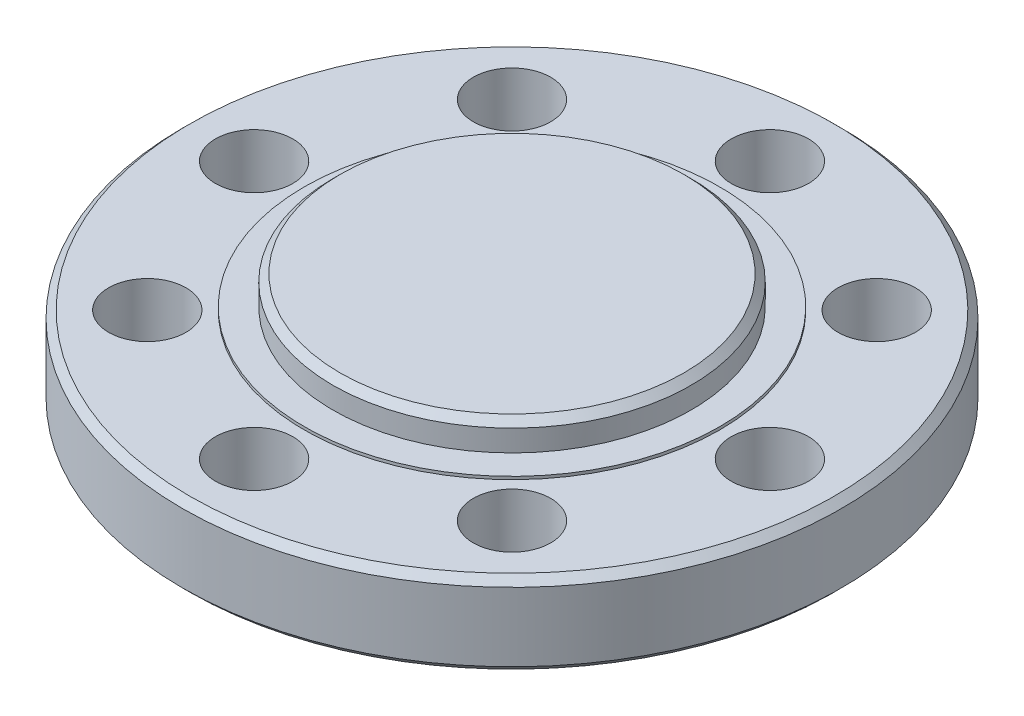
ISO-10303-21;
HEADER;
FILE_DESCRIPTION(('STEP AP214'),'2;1');
FILE_NAME('part.step','',(''),(''),'','','');
FILE_SCHEMA(('AUTOMOTIVE_DESIGN { 1 0 10303 214 1 1 1 1 }'));
ENDSEC;
DATA;
#1=APPLICATION_CONTEXT('core data for automotive mechanical design processes');
#2=APPLICATION_PROTOCOL_DEFINITION('international standard','automotive_design',2000,#1);
#3=PRODUCT_CONTEXT('',#1,'mechanical');
#4=PRODUCT('Part','Part','',(#3));
#5=PRODUCT_RELATED_PRODUCT_CATEGORY('part','',(#4));
#6=PRODUCT_DEFINITION_FORMATION('','',#4);
#7=PRODUCT_DEFINITION_CONTEXT('part definition',#1,'design');
#8=PRODUCT_DEFINITION('design','',#6,#7);
#9=PRODUCT_DEFINITION_SHAPE('','',#8);
#10=(LENGTH_UNIT() NAMED_UNIT(*) SI_UNIT(.MILLI.,.METRE.));
#11=(NAMED_UNIT(*) PLANE_ANGLE_UNIT() SI_UNIT($,.RADIAN.));
#12=(NAMED_UNIT(*) SI_UNIT($,.STERADIAN.) SOLID_ANGLE_UNIT());
#13=UNCERTAINTY_MEASURE_WITH_UNIT(LENGTH_MEASURE(1.E-05),#10,'distance_accuracy_value','');
#14=(GEOMETRIC_REPRESENTATION_CONTEXT(3) GLOBAL_UNCERTAINTY_ASSIGNED_CONTEXT((#13)) GLOBAL_UNIT_ASSIGNED_CONTEXT((#10,
#11,#12)) REPRESENTATION_CONTEXT('',''));
#15=CARTESIAN_POINT('',(0.,0.,0.));
#16=DIRECTION('',(0.,0.,1.));
#17=DIRECTION('',(1.,0.,0.));
#18=AXIS2_PLACEMENT_3D('',#15,#16,#17);
#19=CARTESIAN_POINT('',(0.,0.2499999999589,-1.030652223857E-13));
#20=DIRECTION('',(0.,1.,0.));
#21=DIRECTION('',(0.,0.,-1.));
#22=AXIS2_PLACEMENT_3D('',#19,#20,#21);
#23=CONICAL_SURFACE('',#22,22.74999999996,0.785398163397448);
#24=CARTESIAN_POINT('',(0.,0.5,0.));
#25=DIRECTION('',(0.,1.,0.));
#26=DIRECTION('',(-1.,0.,0.));
#27=AXIS2_PLACEMENT_3D('',#24,#25,#26);
#28=CIRCLE('',#27,23.);
#29=CARTESIAN_POINT('',(0.,0.499999999999503,23.0000000000005));
#30=VERTEX_POINT('',#29);
#31=CARTESIAN_POINT('',(-23.,0.5,0.));
#32=VERTEX_POINT('',#31);
#33=EDGE_CURVE('E28',#30,#32,#28,.T.);
#34=ORIENTED_EDGE('',*,*,#33,.F.);
#35=DIRECTION('',(0.,-0.707106781186548,-0.707106781186548));
#36=VECTOR('',#35,1.);
#37=CARTESIAN_POINT('',(0.,0.2499999999589,22.7499999999599));
#38=LINE('',#37,#36);
#39=CARTESIAN_POINT('',(0.,-5.51364509604468E-13,22.5000000000004));
#40=VERTEX_POINT('',#39);
#41=EDGE_CURVE('E11',#30,#40,#38,.T.);
#42=ORIENTED_EDGE('',*,*,#41,.T.);
#43=CARTESIAN_POINT('',(0.,0.,-1.030652223857E-13));
#44=DIRECTION('',(0.,1.,0.));
#45=DIRECTION('',(1.,0.,0.));
#46=AXIS2_PLACEMENT_3D('',#43,#44,#45);
#47=CIRCLE('',#46,22.5);
#48=EDGE_CURVE('E265',#40,#40,#47,.T.);
#49=ORIENTED_EDGE('',*,*,#48,.T.);
#50=ORIENTED_EDGE('',*,*,#41,.F.);
#51=CARTESIAN_POINT('',(0.,0.5,0.));
#52=DIRECTION('',(0.,1.,0.));
#53=DIRECTION('',(-1.,0.,0.));
#54=AXIS2_PLACEMENT_3D('',#51,#52,#53);
#55=CIRCLE('',#54,23.);
#56=EDGE_CURVE('E160',#32,#30,#55,.T.);
#57=ORIENTED_EDGE('',*,*,#56,.F.);
#58=EDGE_LOOP('',(#34,#42,#49,#50,#57));
#59=FACE_BOUND('',#58,.T.);
#60=ADVANCED_FACE('F17',(#59),#23,.T.);
#61=CARTESIAN_POINT('',(0.,-0.4,0.));
#62=DIRECTION('',(0.,1.,0.));
#63=DIRECTION('',(1.,0.,0.));
#64=AXIS2_PLACEMENT_3D('',#61,#62,#63);
#65=CYLINDRICAL_SURFACE('',#64,23.);
#66=CARTESIAN_POINT('',(0.,5.3,0.));
#67=DIRECTION('',(0.,1.,0.));
#68=DIRECTION('',(1.,0.,0.));
#69=AXIS2_PLACEMENT_3D('',#66,#67,#68);
#70=CIRCLE('',#69,23.);
#71=CARTESIAN_POINT('',(-23.,5.3,0.));
#72=VERTEX_POINT('',#71);
#73=CARTESIAN_POINT('',(0.,5.30000000000095,23.000000000001));
#74=VERTEX_POINT('',#73);
#75=EDGE_CURVE('E150',#72,#74,#70,.T.);
#76=ORIENTED_EDGE('',*,*,#75,.F.);
#77=DIRECTION('',(0.,-1.,0.));
#78=VECTOR('',#77,1.);
#79=CARTESIAN_POINT('',(-23.,-0.4,0.));
#80=LINE('',#79,#78);
#81=EDGE_CURVE('E156',#72,#32,#80,.T.);
#82=ORIENTED_EDGE('',*,*,#81,.T.);
#83=ORIENTED_EDGE('',*,*,#56,.T.);
#84=ORIENTED_EDGE('',*,*,#33,.T.);
#85=ORIENTED_EDGE('',*,*,#81,.F.);
#86=CARTESIAN_POINT('',(0.,5.3,0.));
#87=DIRECTION('',(0.,1.,0.));
#88=DIRECTION('',(1.,0.,0.));
#89=AXIS2_PLACEMENT_3D('',#86,#87,#88);
#90=CIRCLE('',#89,23.);
#91=EDGE_CURVE('E161',#74,#72,#90,.T.);
#92=ORIENTED_EDGE('',*,*,#91,.F.);
#93=EDGE_LOOP('',(#76,#82,#83,#84,#85,#92));
#94=FACE_BOUND('',#93,.T.);
#95=ADVANCED_FACE('F19',(#94),#65,.T.);
#96=CARTESIAN_POINT('',(0.,5.550000000072,-1.030652223857E-13));
#97=DIRECTION('',(0.,-1.,0.));
#98=DIRECTION('',(0.,0.,-1.));
#99=AXIS2_PLACEMENT_3D('',#96,#97,#98);
#100=CONICAL_SURFACE('',#99,22.74999999993,0.785398163397448);
#101=ORIENTED_EDGE('',*,*,#75,.T.);
#102=DIRECTION('',(0.,0.707106781186548,-0.707106781186548));
#103=VECTOR('',#102,1.);
#104=CARTESIAN_POINT('',(0.,5.550000000072,22.7499999999299));
#105=LINE('',#104,#103);
#106=CARTESIAN_POINT('',(0.,5.800000000001,22.5000000000009));
#107=VERTEX_POINT('',#106);
#108=EDGE_CURVE('E154',#74,#107,#105,.T.);
#109=ORIENTED_EDGE('',*,*,#108,.T.);
#110=CARTESIAN_POINT('',(0.,5.8,-1.030652223857E-13));
#111=DIRECTION('',(0.,1.,0.));
#112=DIRECTION('',(1.,0.,0.));
#113=AXIS2_PLACEMENT_3D('',#110,#111,#112);
#114=CIRCLE('',#113,22.5);
#115=EDGE_CURVE('E224',#107,#107,#114,.T.);
#116=ORIENTED_EDGE('',*,*,#115,.F.);
#117=ORIENTED_EDGE('',*,*,#108,.F.);
#118=ORIENTED_EDGE('',*,*,#91,.T.);
#119=EDGE_LOOP('',(#101,#109,#116,#117,#118));
#120=FACE_BOUND('',#119,.T.);
#121=ADVANCED_FACE('F326',(#120),#100,.T.);
#122=CARTESIAN_POINT('',(12.72792206136,5.8,12.72792206136));
#123=DIRECTION('',(0.,-1.,0.));
#124=DIRECTION('',(0.707106781186548,0.,0.707106781186548));
#125=AXIS2_PLACEMENT_3D('',#122,#123,#124);
#126=CYLINDRICAL_SURFACE('',#125,2.7);
#127=CARTESIAN_POINT('',(12.72792206136,5.8,12.72792206136));
#128=DIRECTION('',(0.,-1.,0.));
#129=DIRECTION('',(0.707106781186548,0.,0.707106781186548));
#130=AXIS2_PLACEMENT_3D('',#127,#128,#129);
#131=CIRCLE('',#130,2.7);
#132=CARTESIAN_POINT('',(10.8187337521563,5.8,10.8187337521563));
#133=VERTEX_POINT('',#132);
#134=EDGE_CURVE('E170',#133,#133,#131,.T.);
#135=ORIENTED_EDGE('',*,*,#134,.F.);
#136=DIRECTION('',(0.,-1.,0.));
#137=VECTOR('',#136,1.);
#138=CARTESIAN_POINT('',(10.8187337521563,5.8,10.8187337521563));
#139=LINE('',#138,#137);
#140=CARTESIAN_POINT('',(10.8187337521563,0.,10.8187337521563));
#141=VERTEX_POINT('',#140);
#142=EDGE_CURVE('E155',#133,#141,#139,.T.);
#143=ORIENTED_EDGE('',*,*,#142,.T.);
#144=CARTESIAN_POINT('',(12.72792206136,0.,12.72792206136));
#145=DIRECTION('',(0.,-1.,0.));
#146=DIRECTION('',(0.707106781186548,0.,0.707106781186548));
#147=AXIS2_PLACEMENT_3D('',#144,#145,#146);
#148=CIRCLE('',#147,2.7);
#149=EDGE_CURVE('E182',#141,#141,#148,.T.);
#150=ORIENTED_EDGE('',*,*,#149,.T.);
#151=ORIENTED_EDGE('',*,*,#142,.F.);
#152=EDGE_LOOP('',(#135,#143,#150,#151));
#153=FACE_BOUND('',#152,.T.);
#154=ADVANCED_FACE('F357',(#153),#126,.F.);
#155=CARTESIAN_POINT('',(0.,5.8,18.));
#156=DIRECTION('',(0.,-1.,0.));
#157=DIRECTION('',(0.,0.,1.));
#158=AXIS2_PLACEMENT_3D('',#155,#156,#157);
#159=CYLINDRICAL_SURFACE('',#158,2.7);
#160=CARTESIAN_POINT('',(0.,5.8,18.));
#161=DIRECTION('',(0.,-1.,0.));
#162=DIRECTION('',(0.,0.,1.));
#163=AXIS2_PLACEMENT_3D('',#160,#161,#162);
#164=CIRCLE('',#163,2.7);
#165=CARTESIAN_POINT('',(0.,5.8,15.3));
#166=VERTEX_POINT('',#165);
#167=EDGE_CURVE('E175',#166,#166,#164,.T.);
#168=ORIENTED_EDGE('',*,*,#167,.F.);
#169=DIRECTION('',(0.,-1.,0.));
#170=VECTOR('',#169,1.);
#171=CARTESIAN_POINT('',(0.,5.8,15.3));
#172=LINE('',#171,#170);
#173=CARTESIAN_POINT('',(0.,0.,15.3));
#174=VERTEX_POINT('',#173);
#175=EDGE_CURVE('E169',#166,#174,#172,.T.);
#176=ORIENTED_EDGE('',*,*,#175,.T.);
#177=CARTESIAN_POINT('',(0.,0.,18.));
#178=DIRECTION('',(0.,-1.,0.));
#179=DIRECTION('',(0.,0.,1.));
#180=AXIS2_PLACEMENT_3D('',#177,#178,#179);
#181=CIRCLE('',#180,2.7);
#182=EDGE_CURVE('E193',#174,#174,#181,.T.);
#183=ORIENTED_EDGE('',*,*,#182,.T.);
#184=ORIENTED_EDGE('',*,*,#175,.F.);
#185=EDGE_LOOP('',(#168,#176,#183,#184));
#186=FACE_BOUND('',#185,.T.);
#187=ADVANCED_FACE('F360',(#186),#159,.F.);
#188=CARTESIAN_POINT('',(-12.72792206136,5.8,12.72792206136));
#189=DIRECTION('',(0.,-1.,0.));
#190=DIRECTION('',(-0.707106781186548,0.,0.707106781186548));
#191=AXIS2_PLACEMENT_3D('',#188,#189,#190);
#192=CYLINDRICAL_SURFACE('',#191,2.7);
#193=CARTESIAN_POINT('',(-12.72792206136,5.8,12.72792206136));
#194=DIRECTION('',(0.,-1.,0.));
#195=DIRECTION('',(-0.707106781186548,0.,0.707106781186548));
#196=AXIS2_PLACEMENT_3D('',#193,#194,#195);
#197=CIRCLE('',#196,2.7);
#198=CARTESIAN_POINT('',(-10.8187337521563,5.8,10.8187337521563));
#199=VERTEX_POINT('',#198);
#200=EDGE_CURVE('E21',#199,#199,#197,.T.);
#201=ORIENTED_EDGE('',*,*,#200,.F.);
#202=DIRECTION('',(0.,-1.,0.));
#203=VECTOR('',#202,1.);
#204=CARTESIAN_POINT('',(-10.8187337521563,5.8,10.8187337521563));
#205=LINE('',#204,#203);
#206=CARTESIAN_POINT('',(-10.8187337521563,0.,10.8187337521563));
#207=VERTEX_POINT('',#206);
#208=EDGE_CURVE('E165',#199,#207,#205,.T.);
#209=ORIENTED_EDGE('',*,*,#208,.T.);
#210=CARTESIAN_POINT('',(-12.72792206136,0.,12.72792206136));
#211=DIRECTION('',(0.,-1.,0.));
#212=DIRECTION('',(-0.707106781186548,0.,0.707106781186548));
#213=AXIS2_PLACEMENT_3D('',#210,#211,#212);
#214=CIRCLE('',#213,2.7);
#215=EDGE_CURVE('E203',#207,#207,#214,.T.);
#216=ORIENTED_EDGE('',*,*,#215,.T.);
#217=ORIENTED_EDGE('',*,*,#208,.F.);
#218=EDGE_LOOP('',(#201,#209,#216,#217));
#219=FACE_BOUND('',#218,.T.);
#220=ADVANCED_FACE('F349',(#219),#192,.F.);
#221=CARTESIAN_POINT('',(-18.,5.8,0.));
#222=DIRECTION('',(0.,-1.,0.));
#223=DIRECTION('',(-1.,0.,0.));
#224=AXIS2_PLACEMENT_3D('',#221,#222,#223);
#225=CYLINDRICAL_SURFACE('',#224,2.7);
#226=CARTESIAN_POINT('',(-18.,5.8,0.));
#227=DIRECTION('',(0.,-1.,0.));
#228=DIRECTION('',(-1.,0.,0.));
#229=AXIS2_PLACEMENT_3D('',#226,#227,#228);
#230=CIRCLE('',#229,2.7);
#231=CARTESIAN_POINT('',(-15.3,5.8,0.));
#232=VERTEX_POINT('',#231);
#233=EDGE_CURVE('E215',#232,#232,#230,.T.);
#234=ORIENTED_EDGE('',*,*,#233,.F.);
#235=DIRECTION('',(0.,-1.,0.));
#236=VECTOR('',#235,1.);
#237=CARTESIAN_POINT('',(-15.3,5.8,0.));
#238=LINE('',#237,#236);
#239=CARTESIAN_POINT('',(-15.3,0.,0.));
#240=VERTEX_POINT('',#239);
#241=EDGE_CURVE('E143',#232,#240,#238,.T.);
#242=ORIENTED_EDGE('',*,*,#241,.T.);
#243=CARTESIAN_POINT('',(-18.,0.,0.));
#244=DIRECTION('',(0.,-1.,0.));
#245=DIRECTION('',(-1.,0.,0.));
#246=AXIS2_PLACEMENT_3D('',#243,#244,#245);
#247=CIRCLE('',#246,2.7);
#248=EDGE_CURVE('E210',#240,#240,#247,.T.);
#249=ORIENTED_EDGE('',*,*,#248,.T.);
#250=ORIENTED_EDGE('',*,*,#241,.F.);
#251=EDGE_LOOP('',(#234,#242,#249,#250));
#252=FACE_BOUND('',#251,.T.);
#253=ADVANCED_FACE('F346',(#252),#225,.F.);
#254=CARTESIAN_POINT('',(-12.72792206136,5.8,-12.72792206136));
#255=DIRECTION('',(0.,-1.,0.));
#256=DIRECTION('',(-0.707106781186548,0.,-0.707106781186548));
#257=AXIS2_PLACEMENT_3D('',#254,#255,#256);
#258=CYLINDRICAL_SURFACE('',#257,2.7);
#259=CARTESIAN_POINT('',(-12.72792206136,5.8,-12.72792206136));
#260=DIRECTION('',(0.,-1.,0.));
#261=DIRECTION('',(-0.707106781186548,0.,-0.707106781186548));
#262=AXIS2_PLACEMENT_3D('',#259,#260,#261);
#263=CIRCLE('',#262,2.7);
#264=CARTESIAN_POINT('',(-10.8187337521563,5.8,-10.8187337521563));
#265=VERTEX_POINT('',#264);
#266=EDGE_CURVE('E211',#265,#265,#263,.T.);
#267=ORIENTED_EDGE('',*,*,#266,.F.);
#268=DIRECTION('',(0.,-1.,0.));
#269=VECTOR('',#268,1.);
#270=CARTESIAN_POINT('',(-10.8187337521563,5.8,-10.8187337521563));
#271=LINE('',#270,#269);
#272=CARTESIAN_POINT('',(-10.8187337521563,0.,-10.8187337521563));
#273=VERTEX_POINT('',#272);
#274=EDGE_CURVE('E136',#265,#273,#271,.T.);
#275=ORIENTED_EDGE('',*,*,#274,.T.);
#276=CARTESIAN_POINT('',(-12.72792206136,0.,-12.72792206136));
#277=DIRECTION('',(0.,-1.,0.));
#278=DIRECTION('',(-0.707106781186548,0.,-0.707106781186548));
#279=AXIS2_PLACEMENT_3D('',#276,#277,#278);
#280=CIRCLE('',#279,2.7);
#281=EDGE_CURVE('E222',#273,#273,#280,.T.);
#282=ORIENTED_EDGE('',*,*,#281,.T.);
#283=ORIENTED_EDGE('',*,*,#274,.F.);
#284=EDGE_LOOP('',(#267,#275,#282,#283));
#285=FACE_BOUND('',#284,.T.);
#286=ADVANCED_FACE('F348',(#285),#258,.F.);
#287=CARTESIAN_POINT('',(0.,5.8,-18.));
#288=DIRECTION('',(0.,-1.,0.));
#289=DIRECTION('',(0.,0.,-1.));
#290=AXIS2_PLACEMENT_3D('',#287,#288,#289);
#291=CYLINDRICAL_SURFACE('',#290,2.7);
#292=CARTESIAN_POINT('',(0.,5.8,-18.));
#293=DIRECTION('',(0.,-1.,0.));
#294=DIRECTION('',(0.,0.,-1.));
#295=AXIS2_PLACEMENT_3D('',#292,#293,#294);
#296=CIRCLE('',#295,2.7);
#297=CARTESIAN_POINT('',(0.,5.8,-15.3));
#298=VERTEX_POINT('',#297);
#299=EDGE_CURVE('E134',#298,#298,#296,.T.);
#300=ORIENTED_EDGE('',*,*,#299,.F.);
#301=DIRECTION('',(0.,-1.,0.));
#302=VECTOR('',#301,1.);
#303=CARTESIAN_POINT('',(0.,5.8,-15.3));
#304=LINE('',#303,#302);
#305=CARTESIAN_POINT('',(0.,0.,-15.3));
#306=VERTEX_POINT('',#305);
#307=EDGE_CURVE('E129',#298,#306,#304,.T.);
#308=ORIENTED_EDGE('',*,*,#307,.T.);
#309=CARTESIAN_POINT('',(0.,0.,-18.));
#310=DIRECTION('',(0.,-1.,0.));
#311=DIRECTION('',(0.,0.,-1.));
#312=AXIS2_PLACEMENT_3D('',#309,#310,#311);
#313=CIRCLE('',#312,2.7);
#314=EDGE_CURVE('E132',#306,#306,#313,.T.);
#315=ORIENTED_EDGE('',*,*,#314,.T.);
#316=ORIENTED_EDGE('',*,*,#307,.F.);
#317=EDGE_LOOP('',(#300,#308,#315,#316));
#318=FACE_BOUND('',#317,.T.);
#319=ADVANCED_FACE('F130',(#318),#291,.F.);
#320=CARTESIAN_POINT('',(12.72792206136,5.8,-12.72792206136));
#321=DIRECTION('',(0.,-1.,0.));
#322=DIRECTION('',(0.707106781186548,0.,-0.707106781186548));
#323=AXIS2_PLACEMENT_3D('',#320,#321,#322);
#324=CYLINDRICAL_SURFACE('',#323,2.7);
#325=CARTESIAN_POINT('',(12.72792206136,5.8,-12.72792206136));
#326=DIRECTION('',(0.,-1.,0.));
#327=DIRECTION('',(0.707106781186548,0.,-0.707106781186548));
#328=AXIS2_PLACEMENT_3D('',#325,#326,#327);
#329=CIRCLE('',#328,2.7);
#330=CARTESIAN_POINT('',(10.8187337521563,5.8,-10.8187337521563));
#331=VERTEX_POINT('',#330);
#332=EDGE_CURVE('E227',#331,#331,#329,.T.);
#333=ORIENTED_EDGE('',*,*,#332,.F.);
#334=DIRECTION('',(0.,-1.,0.));
#335=VECTOR('',#334,1.);
#336=CARTESIAN_POINT('',(10.8187337521563,5.8,-10.8187337521563));
#337=LINE('',#336,#335);
#338=CARTESIAN_POINT('',(10.8187337521563,0.,-10.8187337521563));
#339=VERTEX_POINT('',#338);
#340=EDGE_CURVE('E121',#331,#339,#337,.T.);
#341=ORIENTED_EDGE('',*,*,#340,.T.);
#342=CARTESIAN_POINT('',(12.72792206136,0.,-12.72792206136));
#343=DIRECTION('',(0.,-1.,0.));
#344=DIRECTION('',(0.707106781186548,0.,-0.707106781186548));
#345=AXIS2_PLACEMENT_3D('',#342,#343,#344);
#346=CIRCLE('',#345,2.7);
#347=EDGE_CURVE('E223',#339,#339,#346,.T.);
#348=ORIENTED_EDGE('',*,*,#347,.T.);
#349=ORIENTED_EDGE('',*,*,#340,.F.);
#350=EDGE_LOOP('',(#333,#341,#348,#349));
#351=FACE_BOUND('',#350,.T.);
#352=ADVANCED_FACE('F354',(#351),#324,.F.);
#353=CARTESIAN_POINT('',(0.,8.,0.));
#354=DIRECTION('',(0.,1.,0.));
#355=DIRECTION('',(1.,0.,0.));
#356=AXIS2_PLACEMENT_3D('',#353,#354,#355);
#357=PLANE('',#356);
#358=CARTESIAN_POINT('',(0.,8.,0.));
#359=DIRECTION('',(0.,1.,0.));
#360=DIRECTION('',(1.,0.,0.));
#361=AXIS2_PLACEMENT_3D('',#358,#359,#360);
#362=CIRCLE('',#361,12.);
#363=CARTESIAN_POINT('',(0.,8.000000000001,12.000000000001));
#364=VERTEX_POINT('',#363);
#365=EDGE_CURVE('E145',#364,#364,#362,.T.);
#366=ORIENTED_EDGE('',*,*,#365,.T.);
#367=EDGE_LOOP('',(#366));
#368=FACE_BOUND('',#367,.T.);
#369=ADVANCED_FACE('F366',(#368),#357,.T.);
#370=CARTESIAN_POINT('',(0.,7.750000000252,0.));
#371=DIRECTION('',(0.,-1.,0.));
#372=DIRECTION('',(0.,0.,-1.));
#373=AXIS2_PLACEMENT_3D('',#370,#371,#372);
#374=CONICAL_SURFACE('',#373,12.24999999975,0.785398163397448);
#375=CARTESIAN_POINT('',(0.,7.5,0.));
#376=DIRECTION('',(0.,1.,0.));
#377=DIRECTION('',(1.,0.,0.));
#378=AXIS2_PLACEMENT_3D('',#375,#376,#377);
#379=CIRCLE('',#378,12.5);
#380=CARTESIAN_POINT('',(-12.5,7.5,0.));
#381=VERTEX_POINT('',#380);
#382=CARTESIAN_POINT('',(0.,7.50000000000099,12.500000000001));
#383=VERTEX_POINT('',#382);
#384=EDGE_CURVE('E264',#381,#383,#379,.T.);
#385=ORIENTED_EDGE('',*,*,#384,.T.);
#386=DIRECTION('',(0.,0.707106781186548,-0.707106781186548));
#387=VECTOR('',#386,1.);
#388=CARTESIAN_POINT('',(0.,7.750000000252,12.24999999975));
#389=LINE('',#388,#387);
#390=EDGE_CURVE('E216',#383,#364,#389,.T.);
#391=ORIENTED_EDGE('',*,*,#390,.T.);
#392=ORIENTED_EDGE('',*,*,#365,.F.);
#393=ORIENTED_EDGE('',*,*,#390,.F.);
#394=CARTESIAN_POINT('',(0.,7.5,0.));
#395=DIRECTION('',(0.,1.,0.));
#396=DIRECTION('',(1.,0.,0.));
#397=AXIS2_PLACEMENT_3D('',#394,#395,#396);
#398=CIRCLE('',#397,12.5);
#399=EDGE_CURVE('E220',#383,#381,#398,.T.);
#400=ORIENTED_EDGE('',*,*,#399,.T.);
#401=EDGE_LOOP('',(#385,#391,#392,#393,#400));
#402=FACE_BOUND('',#401,.T.);
#403=ADVANCED_FACE('F315',(#402),#374,.T.);
#404=CARTESIAN_POINT('',(0.,-0.4,0.));
#405=DIRECTION('',(0.,1.,0.));
#406=DIRECTION('',(1.,0.,0.));
#407=AXIS2_PLACEMENT_3D('',#404,#405,#406);
#408=CYLINDRICAL_SURFACE('',#407,12.5);
#409=ORIENTED_EDGE('',*,*,#384,.F.);
#410=DIRECTION('',(0.,-1.,0.));
#411=VECTOR('',#410,1.);
#412=CARTESIAN_POINT('',(-12.5,-0.4,0.));
#413=LINE('',#412,#411);
#414=CARTESIAN_POINT('',(-12.5,6.,0.));
#415=VERTEX_POINT('',#414);
#416=EDGE_CURVE('E260',#381,#415,#413,.T.);
#417=ORIENTED_EDGE('',*,*,#416,.T.);
#418=CARTESIAN_POINT('',(0.,6.,0.));
#419=DIRECTION('',(0.,1.,0.));
#420=DIRECTION('',(1.,0.,0.));
#421=AXIS2_PLACEMENT_3D('',#418,#419,#420);
#422=CIRCLE('',#421,12.5);
#423=EDGE_CURVE('E256',#415,#415,#422,.T.);
#424=ORIENTED_EDGE('',*,*,#423,.T.);
#425=ORIENTED_EDGE('',*,*,#416,.F.);
#426=ORIENTED_EDGE('',*,*,#399,.F.);
#427=EDGE_LOOP('',(#409,#417,#424,#425,#426));
#428=FACE_BOUND('',#427,.T.);
#429=ADVANCED_FACE('F305',(#428),#408,.T.);
#430=CARTESIAN_POINT('',(0.,6.,0.));
#431=DIRECTION('',(0.,1.,0.));
#432=DIRECTION('',(1.,0.,0.));
#433=AXIS2_PLACEMENT_3D('',#430,#431,#432);
#434=PLANE('',#433);
#435=ORIENTED_EDGE('',*,*,#423,.F.);
#436=EDGE_LOOP('',(#435));
#437=FACE_BOUND('',#436,.T.);
#438=CARTESIAN_POINT('',(0.,6.,0.));
#439=DIRECTION('',(0.,-1.,0.));
#440=DIRECTION('',(1.,0.,0.));
#441=AXIS2_PLACEMENT_3D('',#438,#439,#440);
#442=CIRCLE('',#441,14.5);
#443=CARTESIAN_POINT('',(-14.5,6.,0.));
#444=VERTEX_POINT('',#443);
#445=EDGE_CURVE('E252',#444,#444,#442,.T.);
#446=ORIENTED_EDGE('',*,*,#445,.F.);
#447=EDGE_LOOP('',(#446));
#448=FACE_BOUND('',#447,.T.);
#449=ADVANCED_FACE('F303',(#437,#448),#434,.T.);
#450=CARTESIAN_POINT('',(0.,-0.4,0.));
#451=DIRECTION('',(0.,1.,0.));
#452=DIRECTION('',(1.,0.,0.));
#453=AXIS2_PLACEMENT_3D('',#450,#451,#452);
#454=CYLINDRICAL_SURFACE('',#453,14.5);
#455=ORIENTED_EDGE('',*,*,#445,.T.);
#456=DIRECTION('',(0.,-1.,0.));
#457=VECTOR('',#456,1.);
#458=CARTESIAN_POINT('',(-14.5,-0.4,0.));
#459=LINE('',#458,#457);
#460=CARTESIAN_POINT('',(-14.5,5.8,0.));
#461=VERTEX_POINT('',#460);
#462=EDGE_CURVE('E253',#444,#461,#459,.T.);
#463=ORIENTED_EDGE('',*,*,#462,.T.);
#464=CARTESIAN_POINT('',(0.,5.8,0.));
#465=DIRECTION('',(0.,1.,0.));
#466=DIRECTION('',(1.,0.,0.));
#467=AXIS2_PLACEMENT_3D('',#464,#465,#466);
#468=CIRCLE('',#467,14.5);
#469=EDGE_CURVE('E174',#461,#461,#468,.T.);
#470=ORIENTED_EDGE('',*,*,#469,.T.);
#471=ORIENTED_EDGE('',*,*,#462,.F.);
#472=EDGE_LOOP('',(#455,#463,#470,#471));
#473=FACE_BOUND('',#472,.T.);
#474=ADVANCED_FACE('F299',(#473),#454,.T.);
#475=CARTESIAN_POINT('',(0.,5.8,0.));
#476=DIRECTION('',(0.,1.,0.));
#477=DIRECTION('',(1.,0.,0.));
#478=AXIS2_PLACEMENT_3D('',#475,#476,#477);
#479=PLANE('',#478);
#480=ORIENTED_EDGE('',*,*,#469,.F.);
#481=EDGE_LOOP('',(#480));
#482=FACE_BOUND('',#481,.T.);
#483=ORIENTED_EDGE('',*,*,#134,.T.);
#484=EDGE_LOOP('',(#483));
#485=FACE_BOUND('',#484,.T.);
#486=ORIENTED_EDGE('',*,*,#167,.T.);
#487=EDGE_LOOP('',(#486));
#488=FACE_BOUND('',#487,.T.);
#489=ORIENTED_EDGE('',*,*,#200,.T.);
#490=EDGE_LOOP('',(#489));
#491=FACE_BOUND('',#490,.T.);
#492=ORIENTED_EDGE('',*,*,#233,.T.);
#493=EDGE_LOOP('',(#492));
#494=FACE_BOUND('',#493,.T.);
#495=ORIENTED_EDGE('',*,*,#266,.T.);
#496=EDGE_LOOP('',(#495));
#497=FACE_BOUND('',#496,.T.);
#498=ORIENTED_EDGE('',*,*,#299,.T.);
#499=EDGE_LOOP('',(#498));
#500=FACE_BOUND('',#499,.T.);
#501=ORIENTED_EDGE('',*,*,#332,.T.);
#502=EDGE_LOOP('',(#501));
#503=FACE_BOUND('',#502,.T.);
#504=CARTESIAN_POINT('',(18.,5.8,0.));
#505=DIRECTION('',(0.,-1.,0.));
#506=DIRECTION('',(1.,0.,0.));
#507=AXIS2_PLACEMENT_3D('',#504,#505,#506);
#508=CIRCLE('',#507,2.7);
#509=CARTESIAN_POINT('',(15.3,5.8,0.));
#510=VERTEX_POINT('',#509);
#511=EDGE_CURVE('E181',#510,#510,#508,.T.);
#512=ORIENTED_EDGE('',*,*,#511,.T.);
#513=EDGE_LOOP('',(#512));
#514=FACE_BOUND('',#513,.T.);
#515=ORIENTED_EDGE('',*,*,#115,.T.);
#516=EDGE_LOOP('',(#515));
#517=FACE_BOUND('',#516,.T.);
#518=ADVANCED_FACE('F313',(#482,#485,#488,#491,#494,#497,#500,#503,#514,#517),#479,.T.);
#519=CARTESIAN_POINT('',(18.,5.8,0.));
#520=DIRECTION('',(0.,-1.,0.));
#521=DIRECTION('',(1.,0.,0.));
#522=AXIS2_PLACEMENT_3D('',#519,#520,#521);
#523=CYLINDRICAL_SURFACE('',#522,2.7);
#524=ORIENTED_EDGE('',*,*,#511,.F.);
#525=DIRECTION('',(0.,-1.,0.));
#526=VECTOR('',#525,1.);
#527=CARTESIAN_POINT('',(15.3,5.8,0.));
#528=LINE('',#527,#526);
#529=CARTESIAN_POINT('',(15.3,0.,0.));
#530=VERTEX_POINT('',#529);
#531=EDGE_CURVE('E190',#510,#530,#528,.T.);
#532=ORIENTED_EDGE('',*,*,#531,.T.);
#533=CARTESIAN_POINT('',(18.,0.,0.));
#534=DIRECTION('',(0.,-1.,0.));
#535=DIRECTION('',(1.,0.,0.));
#536=AXIS2_PLACEMENT_3D('',#533,#534,#535);
#537=CIRCLE('',#536,2.7);
#538=EDGE_CURVE('E178',#530,#530,#537,.T.);
#539=ORIENTED_EDGE('',*,*,#538,.T.);
#540=ORIENTED_EDGE('',*,*,#531,.F.);
#541=EDGE_LOOP('',(#524,#532,#539,#540));
#542=FACE_BOUND('',#541,.T.);
#543=ADVANCED_FACE('F330',(#542),#523,.F.);
#544=CARTESIAN_POINT('',(0.,0.,0.));
#545=DIRECTION('',(0.,1.,0.));
#546=DIRECTION('',(1.,0.,0.));
#547=AXIS2_PLACEMENT_3D('',#544,#545,#546);
#548=PLANE('',#547);
#549=ORIENTED_EDGE('',*,*,#538,.F.);
#550=EDGE_LOOP('',(#549));
#551=FACE_BOUND('',#550,.T.);
#552=ORIENTED_EDGE('',*,*,#149,.F.);
#553=EDGE_LOOP('',(#552));
#554=FACE_BOUND('',#553,.T.);
#555=ORIENTED_EDGE('',*,*,#182,.F.);
#556=EDGE_LOOP('',(#555));
#557=FACE_BOUND('',#556,.T.);
#558=ORIENTED_EDGE('',*,*,#215,.F.);
#559=EDGE_LOOP('',(#558));
#560=FACE_BOUND('',#559,.T.);
#561=ORIENTED_EDGE('',*,*,#248,.F.);
#562=EDGE_LOOP('',(#561));
#563=FACE_BOUND('',#562,.T.);
#564=ORIENTED_EDGE('',*,*,#281,.F.);
#565=EDGE_LOOP('',(#564));
#566=FACE_BOUND('',#565,.T.);
#567=ORIENTED_EDGE('',*,*,#314,.F.);
#568=EDGE_LOOP('',(#567));
#569=FACE_BOUND('',#568,.T.);
#570=ORIENTED_EDGE('',*,*,#347,.F.);
#571=EDGE_LOOP('',(#570));
#572=FACE_BOUND('',#571,.T.);
#573=ORIENTED_EDGE('',*,*,#48,.F.);
#574=EDGE_LOOP('',(#573));
#575=FACE_BOUND('',#574,.T.);
#576=ADVANCED_FACE('F332',(#551,#554,#557,#560,#563,#566,#569,#572,#575),#548,.F.);
#577=CLOSED_SHELL('',(#60,#95,#121,#154,#187,#220,#253,#286,#319,#352,#369,#403,#429,#449,#474,
#518,#543,#576));
#578=MANIFOLD_SOLID_BREP('B1',#577);
#579=ADVANCED_BREP_SHAPE_REPRESENTATION('',(#18,#578),#14);
#580=SHAPE_DEFINITION_REPRESENTATION(#9,#579);
ENDSEC;
END-ISO-10303-21;
